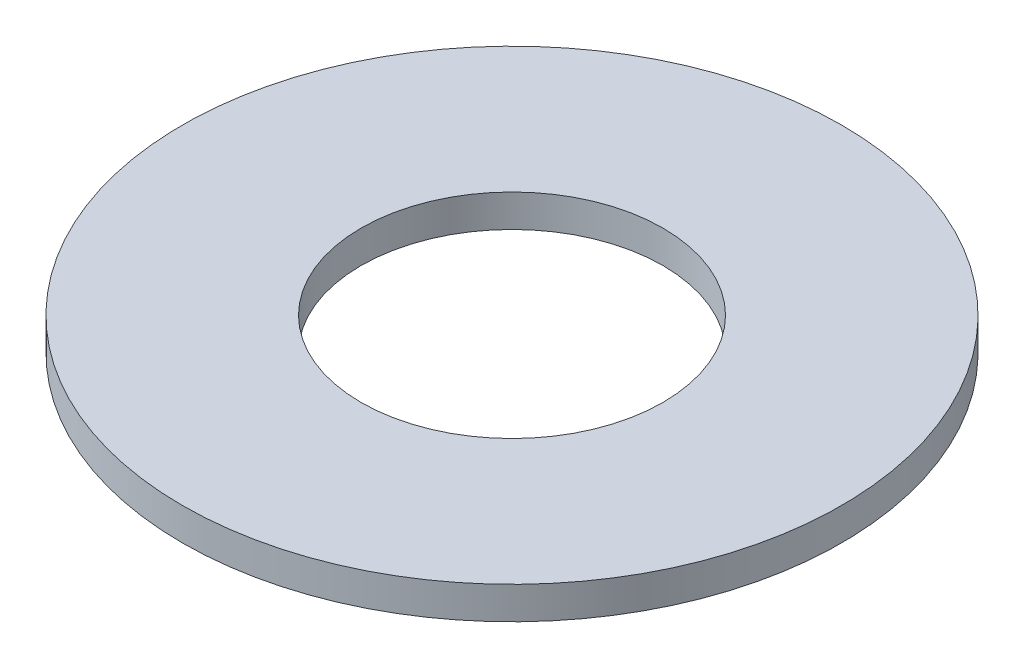
ISO-10303-21;
HEADER;
FILE_DESCRIPTION(('STEP AP214'),'2;1');
FILE_NAME('part.step','',(''),(''),'','','');
FILE_SCHEMA(('AUTOMOTIVE_DESIGN { 1 0 10303 214 1 1 1 1 }'));
ENDSEC;
DATA;
#1=APPLICATION_CONTEXT('core data for automotive mechanical design processes');
#2=APPLICATION_PROTOCOL_DEFINITION('international standard','automotive_design',2000,#1);
#3=PRODUCT_CONTEXT('',#1,'mechanical');
#4=PRODUCT('Part','Part','',(#3));
#5=PRODUCT_RELATED_PRODUCT_CATEGORY('part','',(#4));
#6=PRODUCT_DEFINITION_FORMATION('','',#4);
#7=PRODUCT_DEFINITION_CONTEXT('part definition',#1,'design');
#8=PRODUCT_DEFINITION('design','',#6,#7);
#9=PRODUCT_DEFINITION_SHAPE('','',#8);
#10=(LENGTH_UNIT() NAMED_UNIT(*) SI_UNIT(.MILLI.,.METRE.));
#11=(NAMED_UNIT(*) PLANE_ANGLE_UNIT() SI_UNIT($,.RADIAN.));
#12=(NAMED_UNIT(*) SI_UNIT($,.STERADIAN.) SOLID_ANGLE_UNIT());
#13=UNCERTAINTY_MEASURE_WITH_UNIT(LENGTH_MEASURE(1.E-05),#10,'distance_accuracy_value','');
#14=(GEOMETRIC_REPRESENTATION_CONTEXT(3) GLOBAL_UNCERTAINTY_ASSIGNED_CONTEXT((#13)) GLOBAL_UNIT_ASSIGNED_CONTEXT((#10,
#11,#12)) REPRESENTATION_CONTEXT('',''));
#15=CARTESIAN_POINT('',(0.,0.,0.));
#16=DIRECTION('',(0.,0.,1.));
#17=DIRECTION('',(1.,0.,0.));
#18=AXIS2_PLACEMENT_3D('',#15,#16,#17);
#19=CARTESIAN_POINT('',(0.,0.254,0.));
#20=DIRECTION('',(0.,1.,0.));
#21=DIRECTION('',(0.,0.,1.));
#22=AXIS2_PLACEMENT_3D('',#19,#20,#21);
#23=PLANE('',#22);
#24=CARTESIAN_POINT('',(0.,0.254,0.));
#25=DIRECTION('',(0.,1.,0.));
#26=DIRECTION('',(0.,0.,1.));
#27=AXIS2_PLACEMENT_3D('',#24,#25,#26);
#28=CIRCLE('',#27,2.5781);
#29=CARTESIAN_POINT('',(0.,0.254,2.5781));
#30=VERTEX_POINT('',#29);
#31=EDGE_CURVE('E10',#30,#30,#28,.T.);
#32=ORIENTED_EDGE('',*,*,#31,.T.);
#33=EDGE_LOOP('',(#32));
#34=FACE_BOUND('',#33,.T.);
#35=CARTESIAN_POINT('',(0.,0.254,0.));
#36=DIRECTION('',(0.,1.,0.));
#37=DIRECTION('',(0.,0.,1.));
#38=AXIS2_PLACEMENT_3D('',#35,#36,#37);
#39=CIRCLE('',#38,1.1811);
#40=CARTESIAN_POINT('',(0.,0.254,1.1811));
#41=VERTEX_POINT('',#40);
#42=EDGE_CURVE('E41',#41,#41,#39,.T.);
#43=ORIENTED_EDGE('',*,*,#42,.F.);
#44=EDGE_LOOP('',(#43));
#45=FACE_BOUND('',#44,.T.);
#46=ADVANCED_FACE('F30',(#34,#45),#23,.T.);
#47=CARTESIAN_POINT('',(0.,0.,0.));
#48=DIRECTION('',(0.,1.,0.));
#49=DIRECTION('',(0.,0.,1.));
#50=AXIS2_PLACEMENT_3D('',#47,#48,#49);
#51=PLANE('',#50);
#52=CARTESIAN_POINT('',(0.,0.,0.));
#53=DIRECTION('',(0.,1.,0.));
#54=DIRECTION('',(0.,0.,1.));
#55=AXIS2_PLACEMENT_3D('',#52,#53,#54);
#56=CIRCLE('',#55,2.5781);
#57=CARTESIAN_POINT('',(0.,0.,2.5781));
#58=VERTEX_POINT('',#57);
#59=EDGE_CURVE('E34',#58,#58,#56,.T.);
#60=ORIENTED_EDGE('',*,*,#59,.F.);
#61=EDGE_LOOP('',(#60));
#62=FACE_BOUND('',#61,.T.);
#63=CARTESIAN_POINT('',(0.,0.,0.));
#64=DIRECTION('',(0.,1.,0.));
#65=DIRECTION('',(0.,0.,1.));
#66=AXIS2_PLACEMENT_3D('',#63,#64,#65);
#67=CIRCLE('',#66,1.1811);
#68=CARTESIAN_POINT('',(0.,0.,1.1811));
#69=VERTEX_POINT('',#68);
#70=EDGE_CURVE('E43',#69,#69,#67,.T.);
#71=ORIENTED_EDGE('',*,*,#70,.T.);
#72=EDGE_LOOP('',(#71));
#73=FACE_BOUND('',#72,.T.);
#74=ADVANCED_FACE('F53',(#62,#73),#51,.F.);
#75=CARTESIAN_POINT('',(0.,0.254,0.));
#76=DIRECTION('',(0.,-1.,0.));
#77=DIRECTION('',(0.,0.,-1.));
#78=AXIS2_PLACEMENT_3D('',#75,#76,#77);
#79=CYLINDRICAL_SURFACE('',#78,2.5781);
#80=ORIENTED_EDGE('',*,*,#31,.F.);
#81=EDGE_LOOP('',(#80));
#82=FACE_BOUND('',#81,.T.);
#83=ORIENTED_EDGE('',*,*,#59,.T.);
#84=EDGE_LOOP('',(#83));
#85=FACE_BOUND('',#84,.T.);
#86=ADVANCED_FACE('F32',(#82,#85),#79,.T.);
#87=CARTESIAN_POINT('',(0.,0.254,0.));
#88=DIRECTION('',(0.,-1.,0.));
#89=DIRECTION('',(0.,0.,-1.));
#90=AXIS2_PLACEMENT_3D('',#87,#88,#89);
#91=CYLINDRICAL_SURFACE('',#90,1.1811);
#92=ORIENTED_EDGE('',*,*,#42,.T.);
#93=EDGE_LOOP('',(#92));
#94=FACE_BOUND('',#93,.T.);
#95=ORIENTED_EDGE('',*,*,#70,.F.);
#96=EDGE_LOOP('',(#95));
#97=FACE_BOUND('',#96,.T.);
#98=ADVANCED_FACE('F49',(#94,#97),#91,.F.);
#99=CLOSED_SHELL('',(#46,#74,#86,#98));
#100=MANIFOLD_SOLID_BREP('B2',#99);
#101=ADVANCED_BREP_SHAPE_REPRESENTATION('',(#18,#100),#14);
#102=SHAPE_DEFINITION_REPRESENTATION(#9,#101);
ENDSEC;
END-ISO-10303-21;
